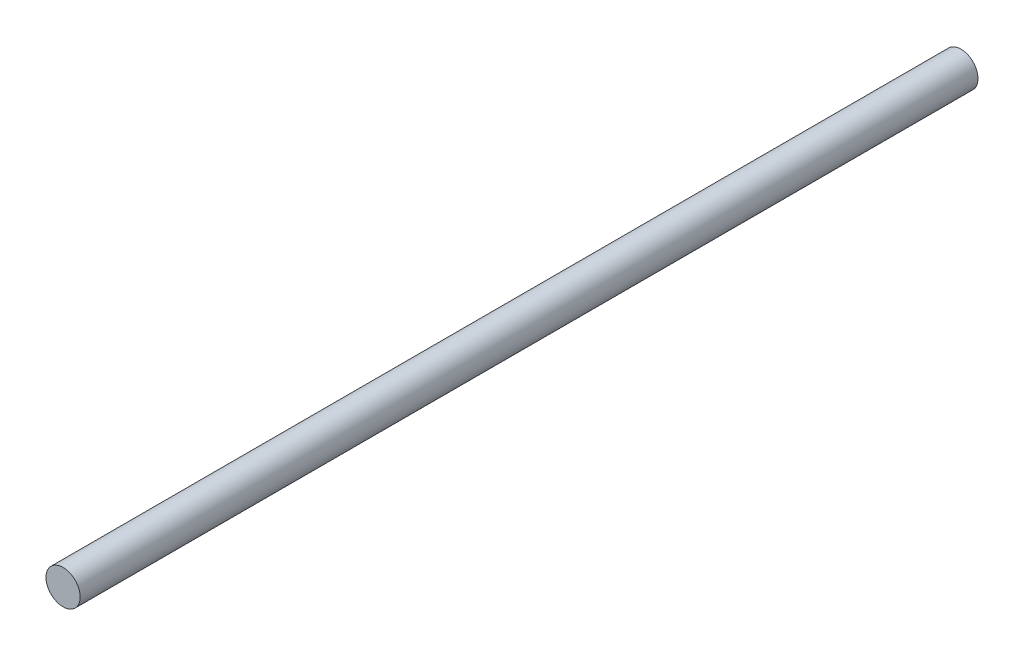
ISO-10303-21;
HEADER;
FILE_DESCRIPTION(('STEP AP214'),'2;1');
FILE_NAME('part.step','',(''),(''),'','','');
FILE_SCHEMA(('AUTOMOTIVE_DESIGN { 1 0 10303 214 1 1 1 1 }'));
ENDSEC;
DATA;
#1=APPLICATION_CONTEXT('core data for automotive mechanical design processes');
#2=APPLICATION_PROTOCOL_DEFINITION('international standard','automotive_design',2000,#1);
#3=PRODUCT_CONTEXT('',#1,'mechanical');
#4=PRODUCT('Part','Part','',(#3));
#5=PRODUCT_RELATED_PRODUCT_CATEGORY('part','',(#4));
#6=PRODUCT_DEFINITION_FORMATION('','',#4);
#7=PRODUCT_DEFINITION_CONTEXT('part definition',#1,'design');
#8=PRODUCT_DEFINITION('design','',#6,#7);
#9=PRODUCT_DEFINITION_SHAPE('','',#8);
#10=(LENGTH_UNIT() NAMED_UNIT(*) SI_UNIT(.MILLI.,.METRE.));
#11=(NAMED_UNIT(*) PLANE_ANGLE_UNIT() SI_UNIT($,.RADIAN.));
#12=(NAMED_UNIT(*) SI_UNIT($,.STERADIAN.) SOLID_ANGLE_UNIT());
#13=UNCERTAINTY_MEASURE_WITH_UNIT(LENGTH_MEASURE(1.E-05),#10,'distance_accuracy_value','');
#14=(GEOMETRIC_REPRESENTATION_CONTEXT(3) GLOBAL_UNCERTAINTY_ASSIGNED_CONTEXT((#13)) GLOBAL_UNIT_ASSIGNED_CONTEXT((#10,
#11,#12)) REPRESENTATION_CONTEXT('',''));
#15=CARTESIAN_POINT('',(0.,0.,0.));
#16=DIRECTION('',(0.,0.,1.));
#17=DIRECTION('',(1.,0.,0.));
#18=AXIS2_PLACEMENT_3D('',#15,#16,#17);
#19=CARTESIAN_POINT('',(0.,0.,-210.));
#20=DIRECTION('',(0.,0.,1.));
#21=DIRECTION('',(1.,0.,0.));
#22=AXIS2_PLACEMENT_3D('',#19,#20,#21);
#23=CYLINDRICAL_SURFACE('',#22,4.);
#24=CARTESIAN_POINT('',(0.,0.,-210.));
#25=DIRECTION('',(0.,0.,1.));
#26=DIRECTION('',(1.,0.,0.));
#27=AXIS2_PLACEMENT_3D('',#24,#25,#26);
#28=CIRCLE('',#27,4.);
#29=CARTESIAN_POINT('',(4.,0.,-210.));
#30=VERTEX_POINT('',#29);
#31=EDGE_CURVE('E10',#30,#30,#28,.T.);
#32=ORIENTED_EDGE('',*,*,#31,.T.);
#33=EDGE_LOOP('',(#32));
#34=FACE_BOUND('',#33,.T.);
#35=CARTESIAN_POINT('',(0.,0.,0.));
#36=DIRECTION('',(0.,0.,1.));
#37=DIRECTION('',(1.,0.,0.));
#38=AXIS2_PLACEMENT_3D('',#35,#36,#37);
#39=CIRCLE('',#38,4.);
#40=CARTESIAN_POINT('',(4.,0.,0.));
#41=VERTEX_POINT('',#40);
#42=EDGE_CURVE('E40',#41,#41,#39,.T.);
#43=ORIENTED_EDGE('',*,*,#42,.F.);
#44=EDGE_LOOP('',(#43));
#45=FACE_BOUND('',#44,.T.);
#46=ADVANCED_FACE('F37',(#34,#45),#23,.T.);
#47=CARTESIAN_POINT('',(0.,0.,-210.));
#48=DIRECTION('',(0.,0.,1.));
#49=DIRECTION('',(1.,0.,0.));
#50=AXIS2_PLACEMENT_3D('',#47,#48,#49);
#51=PLANE('',#50);
#52=ORIENTED_EDGE('',*,*,#31,.F.);
#53=EDGE_LOOP('',(#52));
#54=FACE_BOUND('',#53,.T.);
#55=ADVANCED_FACE('F54',(#54),#51,.F.);
#56=CARTESIAN_POINT('',(0.,0.,0.));
#57=DIRECTION('',(0.,0.,1.));
#58=DIRECTION('',(1.,0.,0.));
#59=AXIS2_PLACEMENT_3D('',#56,#57,#58);
#60=PLANE('',#59);
#61=ORIENTED_EDGE('',*,*,#42,.T.);
#62=EDGE_LOOP('',(#61));
#63=FACE_BOUND('',#62,.T.);
#64=ADVANCED_FACE('F51',(#63),#60,.T.);
#65=CLOSED_SHELL('',(#46,#55,#64));
#66=MANIFOLD_SOLID_BREP('B2',#65);
#67=ADVANCED_BREP_SHAPE_REPRESENTATION('',(#18,#66),#14);
#68=SHAPE_DEFINITION_REPRESENTATION(#9,#67);
ENDSEC;
END-ISO-10303-21;
